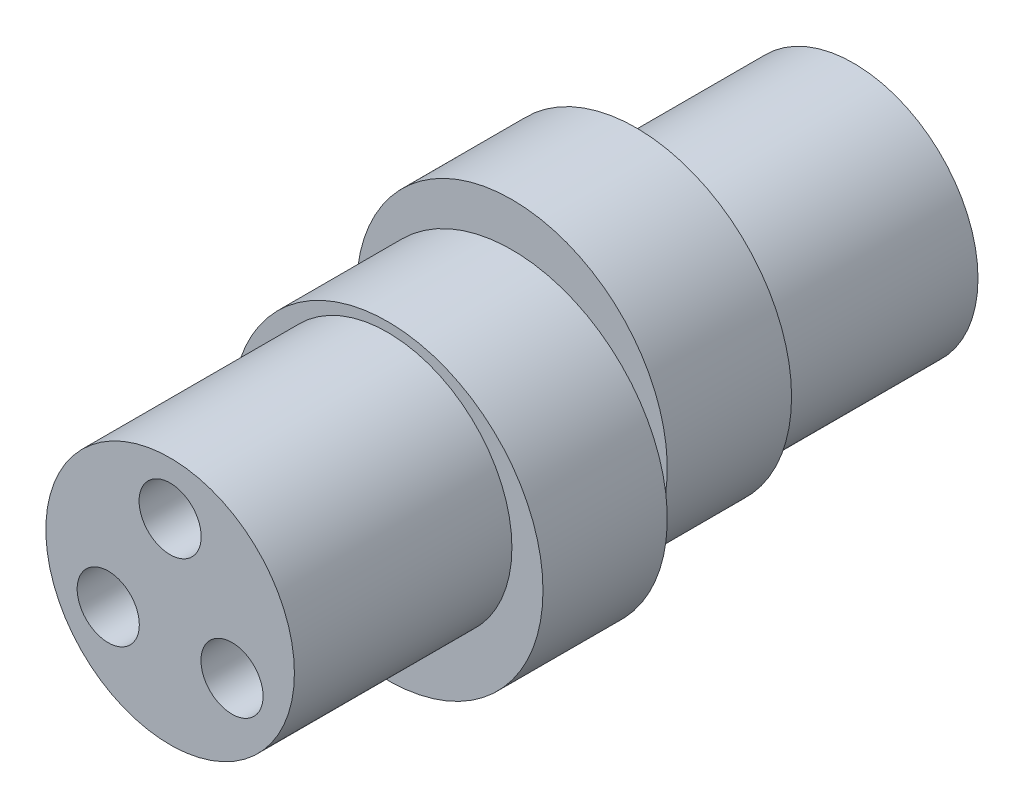
ISO-10303-21;
HEADER;
FILE_DESCRIPTION(('STEP AP214'),'2;1');
FILE_NAME('part.step','',(''),(''),'','','');
FILE_SCHEMA(('AUTOMOTIVE_DESIGN { 1 0 10303 214 1 1 1 1 }'));
ENDSEC;
DATA;
#1=APPLICATION_CONTEXT('core data for automotive mechanical design processes');
#2=APPLICATION_PROTOCOL_DEFINITION('international standard','automotive_design',2000,#1);
#3=PRODUCT_CONTEXT('',#1,'mechanical');
#4=PRODUCT('Part','Part','',(#3));
#5=PRODUCT_RELATED_PRODUCT_CATEGORY('part','',(#4));
#6=PRODUCT_DEFINITION_FORMATION('','',#4);
#7=PRODUCT_DEFINITION_CONTEXT('part definition',#1,'design');
#8=PRODUCT_DEFINITION('design','',#6,#7);
#9=PRODUCT_DEFINITION_SHAPE('','',#8);
#10=(LENGTH_UNIT() NAMED_UNIT(*) SI_UNIT(.MILLI.,.METRE.));
#11=(NAMED_UNIT(*) PLANE_ANGLE_UNIT() SI_UNIT($,.RADIAN.));
#12=(NAMED_UNIT(*) SI_UNIT($,.STERADIAN.) SOLID_ANGLE_UNIT());
#13=UNCERTAINTY_MEASURE_WITH_UNIT(LENGTH_MEASURE(1.E-05),#10,'distance_accuracy_value','');
#14=(GEOMETRIC_REPRESENTATION_CONTEXT(3) GLOBAL_UNCERTAINTY_ASSIGNED_CONTEXT((#13)) GLOBAL_UNIT_ASSIGNED_CONTEXT((#10,
#11,#12)) REPRESENTATION_CONTEXT('',''));
#15=CARTESIAN_POINT('',(0.,0.,0.));
#16=DIRECTION('',(0.,0.,1.));
#17=DIRECTION('',(1.,0.,0.));
#18=AXIS2_PLACEMENT_3D('',#15,#16,#17);
#19=CARTESIAN_POINT('',(0.,0.7,4.));
#20=DIRECTION('',(0.,0.,-1.));
#21=DIRECTION('',(-1.,0.,0.));
#22=AXIS2_PLACEMENT_3D('',#19,#20,#21);
#23=CYLINDRICAL_SURFACE('',#22,5.);
#24=CARTESIAN_POINT('',(0.,0.7,4.));
#25=DIRECTION('',(0.,0.,1.));
#26=DIRECTION('',(1.,0.,0.));
#27=AXIS2_PLACEMENT_3D('',#24,#25,#26);
#28=CIRCLE('',#27,5.);
#29=CARTESIAN_POINT('',(-4.95075751779463,0.,4.));
#30=VERTEX_POINT('',#29);
#31=CARTESIAN_POINT('',(4.95075751779463,0.,4.));
#32=VERTEX_POINT('',#31);
#33=EDGE_CURVE('E52',#30,#32,#28,.T.);
#34=ORIENTED_EDGE('',*,*,#33,.F.);
#35=EDGE_CURVE('E65',#32,#30,#28,.T.);
#36=ORIENTED_EDGE('',*,*,#35,.F.);
#37=EDGE_LOOP('',(#34,#36));
#38=FACE_BOUND('',#37,.T.);
#39=CARTESIAN_POINT('',(0.,0.7,0.));
#40=DIRECTION('',(0.,0.,1.));
#41=DIRECTION('',(1.,0.,0.));
#42=AXIS2_PLACEMENT_3D('',#39,#40,#41);
#43=CIRCLE('',#42,5.);
#44=CARTESIAN_POINT('',(5.,0.7,0.));
#45=VERTEX_POINT('',#44);
#46=EDGE_CURVE('E73',#45,#45,#43,.T.);
#47=ORIENTED_EDGE('',*,*,#46,.T.);
#48=EDGE_LOOP('',(#47));
#49=FACE_BOUND('',#48,.T.);
#50=ADVANCED_FACE('F43',(#38,#49),#23,.T.);
#51=CARTESIAN_POINT('',(0.,0.,4.));
#52=DIRECTION('',(0.,0.,1.));
#53=DIRECTION('',(1.,0.,0.));
#54=AXIS2_PLACEMENT_3D('',#51,#52,#53);
#55=PLANE('',#54);
#56=CARTESIAN_POINT('',(0.,-0.7,4.));
#57=DIRECTION('',(0.,0.,1.));
#58=DIRECTION('',(1.,0.,0.));
#59=AXIS2_PLACEMENT_3D('',#56,#57,#58);
#60=CIRCLE('',#59,5.);
#61=EDGE_CURVE('E59',#32,#30,#60,.T.);
#62=ORIENTED_EDGE('',*,*,#61,.F.);
#63=ORIENTED_EDGE('',*,*,#35,.T.);
#64=EDGE_LOOP('',(#62,#63));
#65=FACE_BOUND('',#64,.T.);
#66=ADVANCED_FACE('F71',(#65),#55,.T.);
#67=CARTESIAN_POINT('',(0.,0.,0.));
#68=DIRECTION('',(0.,0.,1.));
#69=DIRECTION('',(1.,0.,0.));
#70=AXIS2_PLACEMENT_3D('',#67,#68,#69);
#71=PLANE('',#70);
#72=CARTESIAN_POINT('',(0.,0.,0.));
#73=DIRECTION('',(0.,0.,1.));
#74=DIRECTION('',(1.,0.,0.));
#75=AXIS2_PLACEMENT_3D('',#72,#73,#74);
#76=CIRCLE('',#75,4.);
#77=CARTESIAN_POINT('',(4.,0.,0.));
#78=VERTEX_POINT('',#77);
#79=EDGE_CURVE('E11',#78,#78,#76,.F.);
#80=ORIENTED_EDGE('',*,*,#79,.F.);
#81=EDGE_LOOP('',(#80));
#82=FACE_BOUND('',#81,.T.);
#83=ORIENTED_EDGE('',*,*,#46,.F.);
#84=EDGE_LOOP('',(#83));
#85=FACE_BOUND('',#84,.T.);
#86=ADVANCED_FACE('F89',(#82,#85),#71,.F.);
#87=CARTESIAN_POINT('',(0.,-0.7,4.));
#88=DIRECTION('',(0.,0.,1.));
#89=DIRECTION('',(1.,0.,0.));
#90=AXIS2_PLACEMENT_3D('',#87,#88,#89);
#91=PLANE('',#90);
#92=EDGE_CURVE('E74',#30,#32,#60,.T.);
#93=ORIENTED_EDGE('',*,*,#92,.F.);
#94=ORIENTED_EDGE('',*,*,#33,.T.);
#95=EDGE_LOOP('',(#93,#94));
#96=FACE_BOUND('',#95,.T.);
#97=ADVANCED_FACE('F75',(#96),#91,.F.);
#98=CARTESIAN_POINT('',(0.,-0.7,8.));
#99=DIRECTION('',(0.,0.,-1.));
#100=DIRECTION('',(-1.,0.,0.));
#101=AXIS2_PLACEMENT_3D('',#98,#99,#100);
#102=CYLINDRICAL_SURFACE('',#101,5.);
#103=CARTESIAN_POINT('',(0.,-0.7,8.));
#104=DIRECTION('',(0.,0.,1.));
#105=DIRECTION('',(1.,0.,0.));
#106=AXIS2_PLACEMENT_3D('',#103,#104,#105);
#107=CIRCLE('',#106,5.);
#108=CARTESIAN_POINT('',(5.,-0.7,8.));
#109=VERTEX_POINT('',#108);
#110=EDGE_CURVE('E81',#109,#109,#107,.T.);
#111=ORIENTED_EDGE('',*,*,#110,.F.);
#112=EDGE_LOOP('',(#111));
#113=FACE_BOUND('',#112,.T.);
#114=ORIENTED_EDGE('',*,*,#61,.T.);
#115=ORIENTED_EDGE('',*,*,#92,.T.);
#116=EDGE_LOOP('',(#114,#115));
#117=FACE_BOUND('',#116,.T.);
#118=ADVANCED_FACE('F79',(#113,#117),#102,.T.);
#119=CARTESIAN_POINT('',(0.,-0.7,8.));
#120=DIRECTION('',(0.,0.,1.));
#121=DIRECTION('',(1.,0.,0.));
#122=AXIS2_PLACEMENT_3D('',#119,#120,#121);
#123=PLANE('',#122);
#124=CARTESIAN_POINT('',(0.,0.,8.));
#125=DIRECTION('',(0.,0.,1.));
#126=DIRECTION('',(1.,0.,0.));
#127=AXIS2_PLACEMENT_3D('',#124,#125,#126);
#128=CIRCLE('',#127,4.);
#129=CARTESIAN_POINT('',(4.,0.,8.));
#130=VERTEX_POINT('',#129);
#131=EDGE_CURVE('E46',#130,#130,#128,.F.);
#132=ORIENTED_EDGE('',*,*,#131,.T.);
#133=EDGE_LOOP('',(#132));
#134=FACE_BOUND('',#133,.T.);
#135=ORIENTED_EDGE('',*,*,#110,.T.);
#136=EDGE_LOOP('',(#135));
#137=FACE_BOUND('',#136,.T.);
#138=ADVANCED_FACE('F123',(#134,#137),#123,.T.);
#139=CARTESIAN_POINT('',(0.,0.,15.));
#140=DIRECTION('',(0.,0.,1.));
#141=DIRECTION('',(1.,0.,0.));
#142=AXIS2_PLACEMENT_3D('',#139,#140,#141);
#143=PLANE('',#142);
#144=CARTESIAN_POINT('',(0.,2.3,15.));
#145=DIRECTION('',(0.,0.,1.));
#146=DIRECTION('',(1.,0.,0.));
#147=AXIS2_PLACEMENT_3D('',#144,#145,#146);
#148=CIRCLE('',#147,1.);
#149=CARTESIAN_POINT('',(1.,2.3,15.));
#150=VERTEX_POINT('',#149);
#151=EDGE_CURVE('E217',#150,#150,#148,.T.);
#152=ORIENTED_EDGE('',*,*,#151,.F.);
#153=EDGE_LOOP('',(#152));
#154=FACE_BOUND('',#153,.T.);
#155=CARTESIAN_POINT('',(-1.99185842870411,-1.15000000000006,15.));
#156=DIRECTION('',(0.,0.,1.));
#157=DIRECTION('',(1.,0.,0.));
#158=AXIS2_PLACEMENT_3D('',#155,#156,#157);
#159=CIRCLE('',#158,1.);
#160=CARTESIAN_POINT('',(-0.991858428704113,-1.15000000000006,15.));
#161=VERTEX_POINT('',#160);
#162=EDGE_CURVE('E226',#161,#161,#159,.T.);
#163=ORIENTED_EDGE('',*,*,#162,.F.);
#164=EDGE_LOOP('',(#163));
#165=FACE_BOUND('',#164,.T.);
#166=CARTESIAN_POINT('',(1.9918584287043,-1.14999999999994,15.));
#167=DIRECTION('',(0.,0.,1.));
#168=DIRECTION('',(1.,0.,0.));
#169=AXIS2_PLACEMENT_3D('',#166,#167,#168);
#170=CIRCLE('',#169,1.);
#171=CARTESIAN_POINT('',(2.9918584287043,-1.14999999999994,15.));
#172=VERTEX_POINT('',#171);
#173=EDGE_CURVE('E233',#172,#172,#170,.T.);
#174=ORIENTED_EDGE('',*,*,#173,.F.);
#175=EDGE_LOOP('',(#174));
#176=FACE_BOUND('',#175,.T.);
#177=CARTESIAN_POINT('',(0.,0.,15.));
#178=DIRECTION('',(0.,0.,1.));
#179=DIRECTION('',(1.,0.,0.));
#180=AXIS2_PLACEMENT_3D('',#177,#178,#179);
#181=CIRCLE('',#180,4.);
#182=CARTESIAN_POINT('',(4.,0.,15.));
#183=VERTEX_POINT('',#182);
#184=EDGE_CURVE('E243',#183,#183,#181,.T.);
#185=ORIENTED_EDGE('',*,*,#184,.T.);
#186=EDGE_LOOP('',(#185));
#187=FACE_BOUND('',#186,.T.);
#188=ADVANCED_FACE('F138',(#154,#165,#176,#187),#143,.T.);
#189=CARTESIAN_POINT('',(0.,0.,15.));
#190=DIRECTION('',(0.,0.,-1.));
#191=DIRECTION('',(-1.,0.,0.));
#192=AXIS2_PLACEMENT_3D('',#189,#190,#191);
#193=CYLINDRICAL_SURFACE('',#192,4.);
#194=ORIENTED_EDGE('',*,*,#131,.F.);
#195=EDGE_LOOP('',(#194));
#196=FACE_BOUND('',#195,.T.);
#197=ORIENTED_EDGE('',*,*,#184,.F.);
#198=EDGE_LOOP('',(#197));
#199=FACE_BOUND('',#198,.T.);
#200=ADVANCED_FACE('F146',(#196,#199),#193,.T.);
#201=CARTESIAN_POINT('',(0.,0.,-7.));
#202=DIRECTION('',(0.,0.,1.));
#203=DIRECTION('',(1.,0.,0.));
#204=AXIS2_PLACEMENT_3D('',#201,#202,#203);
#205=CIRCLE('',#204,4.);
#206=CARTESIAN_POINT('',(4.,0.,-7.));
#207=VERTEX_POINT('',#206);
#208=EDGE_CURVE('E223',#207,#207,#205,.T.);
#209=ORIENTED_EDGE('',*,*,#208,.T.);
#210=EDGE_LOOP('',(#209));
#211=FACE_BOUND('',#210,.T.);
#212=ORIENTED_EDGE('',*,*,#79,.T.);
#213=EDGE_LOOP('',(#212));
#214=FACE_BOUND('',#213,.T.);
#215=ADVANCED_FACE('F151',(#211,#214),#193,.T.);
#216=CARTESIAN_POINT('',(0.,0.,-7.));
#217=DIRECTION('',(0.,0.,1.));
#218=DIRECTION('',(1.,0.,0.));
#219=AXIS2_PLACEMENT_3D('',#216,#217,#218);
#220=PLANE('',#219);
#221=CARTESIAN_POINT('',(0.,2.3,-7.));
#222=DIRECTION('',(0.,0.,1.));
#223=DIRECTION('',(1.,0.,0.));
#224=AXIS2_PLACEMENT_3D('',#221,#222,#223);
#225=CIRCLE('',#224,1.);
#226=CARTESIAN_POINT('',(1.,2.3,-7.));
#227=VERTEX_POINT('',#226);
#228=EDGE_CURVE('E214',#227,#227,#225,.T.);
#229=ORIENTED_EDGE('',*,*,#228,.T.);
#230=EDGE_LOOP('',(#229));
#231=FACE_BOUND('',#230,.T.);
#232=CARTESIAN_POINT('',(-1.99185842870411,-1.15000000000006,-7.));
#233=DIRECTION('',(0.,0.,1.));
#234=DIRECTION('',(1.,0.,0.));
#235=AXIS2_PLACEMENT_3D('',#232,#233,#234);
#236=CIRCLE('',#235,1.);
#237=CARTESIAN_POINT('',(-0.991858428704113,-1.15000000000006,-7.));
#238=VERTEX_POINT('',#237);
#239=EDGE_CURVE('E219',#238,#238,#236,.T.);
#240=ORIENTED_EDGE('',*,*,#239,.T.);
#241=EDGE_LOOP('',(#240));
#242=FACE_BOUND('',#241,.T.);
#243=CARTESIAN_POINT('',(1.9918584287043,-1.14999999999994,-7.));
#244=DIRECTION('',(0.,0.,1.));
#245=DIRECTION('',(1.,0.,0.));
#246=AXIS2_PLACEMENT_3D('',#243,#244,#245);
#247=CIRCLE('',#246,1.);
#248=CARTESIAN_POINT('',(2.9918584287043,-1.14999999999994,-7.));
#249=VERTEX_POINT('',#248);
#250=EDGE_CURVE('E231',#249,#249,#247,.T.);
#251=ORIENTED_EDGE('',*,*,#250,.T.);
#252=EDGE_LOOP('',(#251));
#253=FACE_BOUND('',#252,.T.);
#254=ORIENTED_EDGE('',*,*,#208,.F.);
#255=EDGE_LOOP('',(#254));
#256=FACE_BOUND('',#255,.T.);
#257=ADVANCED_FACE('F161',(#231,#242,#253,#256),#220,.F.);
#258=CARTESIAN_POINT('',(1.9918584287043,-1.14999999999994,-7.));
#259=DIRECTION('',(0.,0.,1.));
#260=DIRECTION('',(1.,0.,0.));
#261=AXIS2_PLACEMENT_3D('',#258,#259,#260);
#262=CYLINDRICAL_SURFACE('',#261,1.);
#263=ORIENTED_EDGE('',*,*,#250,.F.);
#264=EDGE_LOOP('',(#263));
#265=FACE_BOUND('',#264,.T.);
#266=ORIENTED_EDGE('',*,*,#173,.T.);
#267=EDGE_LOOP('',(#266));
#268=FACE_BOUND('',#267,.T.);
#269=ADVANCED_FACE('F177',(#265,#268),#262,.F.);
#270=CARTESIAN_POINT('',(-1.99185842870411,-1.15000000000006,-7.));
#271=DIRECTION('',(0.,0.,1.));
#272=DIRECTION('',(1.,0.,0.));
#273=AXIS2_PLACEMENT_3D('',#270,#271,#272);
#274=CYLINDRICAL_SURFACE('',#273,1.);
#275=ORIENTED_EDGE('',*,*,#239,.F.);
#276=EDGE_LOOP('',(#275));
#277=FACE_BOUND('',#276,.T.);
#278=ORIENTED_EDGE('',*,*,#162,.T.);
#279=EDGE_LOOP('',(#278));
#280=FACE_BOUND('',#279,.T.);
#281=ADVANCED_FACE('F187',(#277,#280),#274,.F.);
#282=CARTESIAN_POINT('',(0.,2.3,-7.));
#283=DIRECTION('',(0.,0.,1.));
#284=DIRECTION('',(1.,0.,0.));
#285=AXIS2_PLACEMENT_3D('',#282,#283,#284);
#286=CYLINDRICAL_SURFACE('',#285,1.);
#287=ORIENTED_EDGE('',*,*,#228,.F.);
#288=EDGE_LOOP('',(#287));
#289=FACE_BOUND('',#288,.T.);
#290=ORIENTED_EDGE('',*,*,#151,.T.);
#291=EDGE_LOOP('',(#290));
#292=FACE_BOUND('',#291,.T.);
#293=ADVANCED_FACE('F197',(#289,#292),#286,.F.);
#294=CLOSED_SHELL('',(#50,#66,#86,#97,#118,#138,#188,#200,#215,#257,#269,#281,#293));
#295=MANIFOLD_SOLID_BREP('B2',#294);
#296=ADVANCED_BREP_SHAPE_REPRESENTATION('',(#18,#295),#14);
#297=SHAPE_DEFINITION_REPRESENTATION(#9,#296);
ENDSEC;
END-ISO-10303-21;
